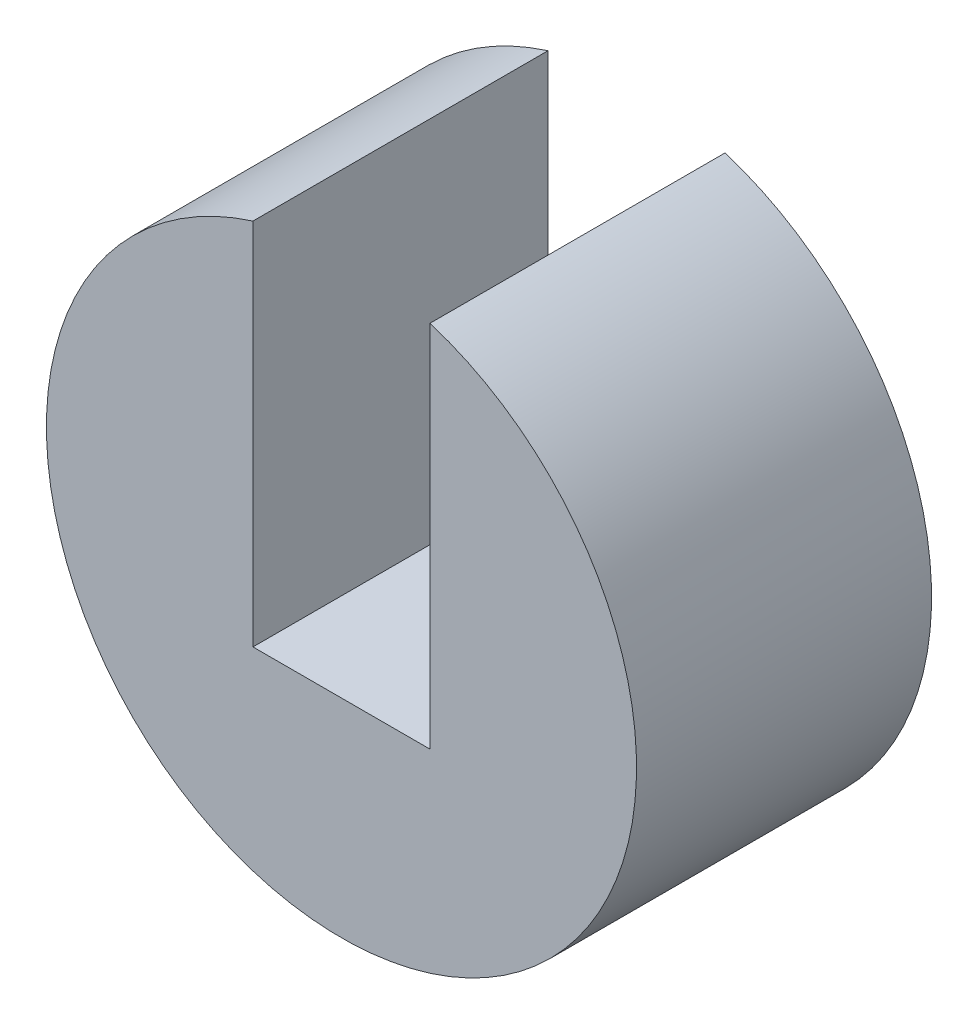
ISO-10303-21;
HEADER;
FILE_DESCRIPTION(('STEP AP214'),'2;1');
FILE_NAME('part.step','',(''),(''),'','','');
FILE_SCHEMA(('AUTOMOTIVE_DESIGN { 1 0 10303 214 1 1 1 1 }'));
ENDSEC;
DATA;
#1=APPLICATION_CONTEXT('core data for automotive mechanical design processes');
#2=APPLICATION_PROTOCOL_DEFINITION('international standard','automotive_design',2000,#1);
#3=PRODUCT_CONTEXT('',#1,'mechanical');
#4=PRODUCT('Part','Part','',(#3));
#5=PRODUCT_RELATED_PRODUCT_CATEGORY('part','',(#4));
#6=PRODUCT_DEFINITION_FORMATION('','',#4);
#7=PRODUCT_DEFINITION_CONTEXT('part definition',#1,'design');
#8=PRODUCT_DEFINITION('design','',#6,#7);
#9=PRODUCT_DEFINITION_SHAPE('','',#8);
#10=(LENGTH_UNIT() NAMED_UNIT(*) SI_UNIT(.MILLI.,.METRE.));
#11=(NAMED_UNIT(*) PLANE_ANGLE_UNIT() SI_UNIT($,.RADIAN.));
#12=(NAMED_UNIT(*) SI_UNIT($,.STERADIAN.) SOLID_ANGLE_UNIT());
#13=UNCERTAINTY_MEASURE_WITH_UNIT(LENGTH_MEASURE(1.E-05),#10,'distance_accuracy_value','');
#14=(GEOMETRIC_REPRESENTATION_CONTEXT(3) GLOBAL_UNCERTAINTY_ASSIGNED_CONTEXT((#13)) GLOBAL_UNIT_ASSIGNED_CONTEXT((#10,
#11,#12)) REPRESENTATION_CONTEXT('',''));
#15=CARTESIAN_POINT('',(0.,0.,0.));
#16=DIRECTION('',(0.,0.,1.));
#17=DIRECTION('',(1.,0.,0.));
#18=AXIS2_PLACEMENT_3D('',#15,#16,#17);
#19=CARTESIAN_POINT('',(-1.5,0.,5.));
#20=DIRECTION('',(-1.,0.,0.));
#21=DIRECTION('',(0.,0.,1.));
#22=AXIS2_PLACEMENT_3D('',#19,#20,#21);
#23=PLANE('',#22);
#24=DIRECTION('',(0.,1.,0.));
#25=VECTOR('',#24,1.);
#26=CARTESIAN_POINT('',(-1.5,0.,0.));
#27=LINE('',#26,#25);
#28=CARTESIAN_POINT('',(-1.5,-3.125,0.));
#29=VERTEX_POINT('',#28);
#30=CARTESIAN_POINT('',(-1.5,3.125,0.));
#31=VERTEX_POINT('',#30);
#32=EDGE_CURVE('E103',#29,#31,#27,.T.);
#33=ORIENTED_EDGE('',*,*,#32,.T.);
#34=DIRECTION('',(0.,0.,-1.));
#35=VECTOR('',#34,1.);
#36=CARTESIAN_POINT('',(-1.5,3.125,5.));
#37=LINE('',#36,#35);
#38=CARTESIAN_POINT('',(-1.5,3.125,5.));
#39=VERTEX_POINT('',#38);
#40=EDGE_CURVE('E11',#39,#31,#37,.T.);
#41=ORIENTED_EDGE('',*,*,#40,.F.);
#42=DIRECTION('',(0.,1.,0.));
#43=VECTOR('',#42,1.);
#44=CARTESIAN_POINT('',(-1.5,0.,5.));
#45=LINE('',#44,#43);
#46=CARTESIAN_POINT('',(-1.5,-3.125,5.));
#47=VERTEX_POINT('',#46);
#48=EDGE_CURVE('E88',#47,#39,#45,.T.);
#49=ORIENTED_EDGE('',*,*,#48,.F.);
#50=DIRECTION('',(0.,0.,-1.));
#51=VECTOR('',#50,1.);
#52=CARTESIAN_POINT('',(-1.5,-3.125,5.));
#53=LINE('',#52,#51);
#54=EDGE_CURVE('E99',#47,#29,#53,.T.);
#55=ORIENTED_EDGE('',*,*,#54,.T.);
#56=EDGE_LOOP('',(#33,#41,#49,#55));
#57=FACE_BOUND('',#56,.T.);
#58=ADVANCED_FACE('F41',(#57),#23,.F.);
#59=CARTESIAN_POINT('',(0.,-1.64469600708473,5.));
#60=DIRECTION('',(0.,0.,-1.));
#61=DIRECTION('',(-1.,0.,0.));
#62=AXIS2_PLACEMENT_3D('',#59,#60,#61);
#63=CYLINDRICAL_SURFACE('',#62,5.);
#64=CARTESIAN_POINT('',(0.,-1.64469600708473,0.));
#65=DIRECTION('',(0.,0.,1.));
#66=DIRECTION('',(1.,0.,0.));
#67=AXIS2_PLACEMENT_3D('',#64,#65,#66);
#68=CIRCLE('',#67,5.);
#69=CARTESIAN_POINT('',(1.5,3.125,0.));
#70=VERTEX_POINT('',#69);
#71=EDGE_CURVE('E93',#31,#70,#68,.T.);
#72=ORIENTED_EDGE('',*,*,#71,.T.);
#73=DIRECTION('',(0.,0.,-1.));
#74=VECTOR('',#73,1.);
#75=CARTESIAN_POINT('',(1.5,3.125,5.));
#76=LINE('',#75,#74);
#77=CARTESIAN_POINT('',(1.5,3.125,5.));
#78=VERTEX_POINT('',#77);
#79=EDGE_CURVE('E49',#78,#70,#76,.T.);
#80=ORIENTED_EDGE('',*,*,#79,.F.);
#81=CARTESIAN_POINT('',(0.,-1.64469600708473,5.));
#82=DIRECTION('',(0.,0.,1.));
#83=DIRECTION('',(1.,0.,0.));
#84=AXIS2_PLACEMENT_3D('',#81,#82,#83);
#85=CIRCLE('',#84,5.);
#86=EDGE_CURVE('E83',#39,#78,#85,.T.);
#87=ORIENTED_EDGE('',*,*,#86,.F.);
#88=ORIENTED_EDGE('',*,*,#40,.T.);
#89=EDGE_LOOP('',(#72,#80,#87,#88));
#90=FACE_BOUND('',#89,.T.);
#91=ADVANCED_FACE('F92',(#90),#63,.T.);
#92=CARTESIAN_POINT('',(1.5,0.,5.));
#93=DIRECTION('',(-1.,0.,0.));
#94=DIRECTION('',(0.,0.,1.));
#95=AXIS2_PLACEMENT_3D('',#92,#93,#94);
#96=PLANE('',#95);
#97=DIRECTION('',(0.,1.,0.));
#98=VECTOR('',#97,1.);
#99=CARTESIAN_POINT('',(1.5,0.,0.));
#100=LINE('',#99,#98);
#101=CARTESIAN_POINT('',(1.5,-3.125,0.));
#102=VERTEX_POINT('',#101);
#103=EDGE_CURVE('E107',#102,#70,#100,.T.);
#104=ORIENTED_EDGE('',*,*,#103,.F.);
#105=DIRECTION('',(0.,0.,-1.));
#106=VECTOR('',#105,1.);
#107=CARTESIAN_POINT('',(1.5,-3.125,5.));
#108=LINE('',#107,#106);
#109=CARTESIAN_POINT('',(1.5,-3.125,5.));
#110=VERTEX_POINT('',#109);
#111=EDGE_CURVE('E73',#110,#102,#108,.T.);
#112=ORIENTED_EDGE('',*,*,#111,.F.);
#113=DIRECTION('',(0.,1.,0.));
#114=VECTOR('',#113,1.);
#115=CARTESIAN_POINT('',(1.5,0.,5.));
#116=LINE('',#115,#114);
#117=EDGE_CURVE('E86',#110,#78,#116,.T.);
#118=ORIENTED_EDGE('',*,*,#117,.T.);
#119=ORIENTED_EDGE('',*,*,#79,.T.);
#120=EDGE_LOOP('',(#104,#112,#118,#119));
#121=FACE_BOUND('',#120,.T.);
#122=ADVANCED_FACE('F97',(#121),#96,.T.);
#123=CARTESIAN_POINT('',(0.,-3.125,5.));
#124=DIRECTION('',(0.,-1.,0.));
#125=DIRECTION('',(0.,0.,-1.));
#126=AXIS2_PLACEMENT_3D('',#123,#124,#125);
#127=PLANE('',#126);
#128=DIRECTION('',(-1.,0.,0.));
#129=VECTOR('',#128,1.);
#130=CARTESIAN_POINT('',(0.,-3.125,0.));
#131=LINE('',#130,#129);
#132=EDGE_CURVE('E76',#102,#29,#131,.T.);
#133=ORIENTED_EDGE('',*,*,#132,.T.);
#134=ORIENTED_EDGE('',*,*,#54,.F.);
#135=DIRECTION('',(-1.,0.,0.));
#136=VECTOR('',#135,1.);
#137=CARTESIAN_POINT('',(0.,-3.125,5.));
#138=LINE('',#137,#136);
#139=EDGE_CURVE('E57',#110,#47,#138,.T.);
#140=ORIENTED_EDGE('',*,*,#139,.F.);
#141=ORIENTED_EDGE('',*,*,#111,.T.);
#142=EDGE_LOOP('',(#133,#134,#140,#141));
#143=FACE_BOUND('',#142,.T.);
#144=ADVANCED_FACE('F120',(#143),#127,.F.);
#145=CARTESIAN_POINT('',(0.,0.,5.));
#146=DIRECTION('',(0.,0.,1.));
#147=DIRECTION('',(1.,0.,0.));
#148=AXIS2_PLACEMENT_3D('',#145,#146,#147);
#149=PLANE('',#148);
#150=ORIENTED_EDGE('',*,*,#48,.T.);
#151=ORIENTED_EDGE('',*,*,#86,.T.);
#152=ORIENTED_EDGE('',*,*,#117,.F.);
#153=ORIENTED_EDGE('',*,*,#139,.T.);
#154=EDGE_LOOP('',(#150,#151,#152,#153));
#155=FACE_BOUND('',#154,.T.);
#156=ADVANCED_FACE('F84',(#155),#149,.T.);
#157=CARTESIAN_POINT('',(0.,0.,0.));
#158=DIRECTION('',(0.,0.,1.));
#159=DIRECTION('',(1.,0.,0.));
#160=AXIS2_PLACEMENT_3D('',#157,#158,#159);
#161=PLANE('',#160);
#162=ORIENTED_EDGE('',*,*,#32,.F.);
#163=ORIENTED_EDGE('',*,*,#132,.F.);
#164=ORIENTED_EDGE('',*,*,#103,.T.);
#165=ORIENTED_EDGE('',*,*,#71,.F.);
#166=EDGE_LOOP('',(#162,#163,#164,#165));
#167=FACE_BOUND('',#166,.T.);
#168=ADVANCED_FACE('F114',(#167),#161,.F.);
#169=CLOSED_SHELL('',(#58,#91,#122,#144,#156,#168));
#170=MANIFOLD_SOLID_BREP('B2',#169);
#171=ADVANCED_BREP_SHAPE_REPRESENTATION('',(#18,#170),#14);
#172=SHAPE_DEFINITION_REPRESENTATION(#9,#171);
ENDSEC;
END-ISO-10303-21;
